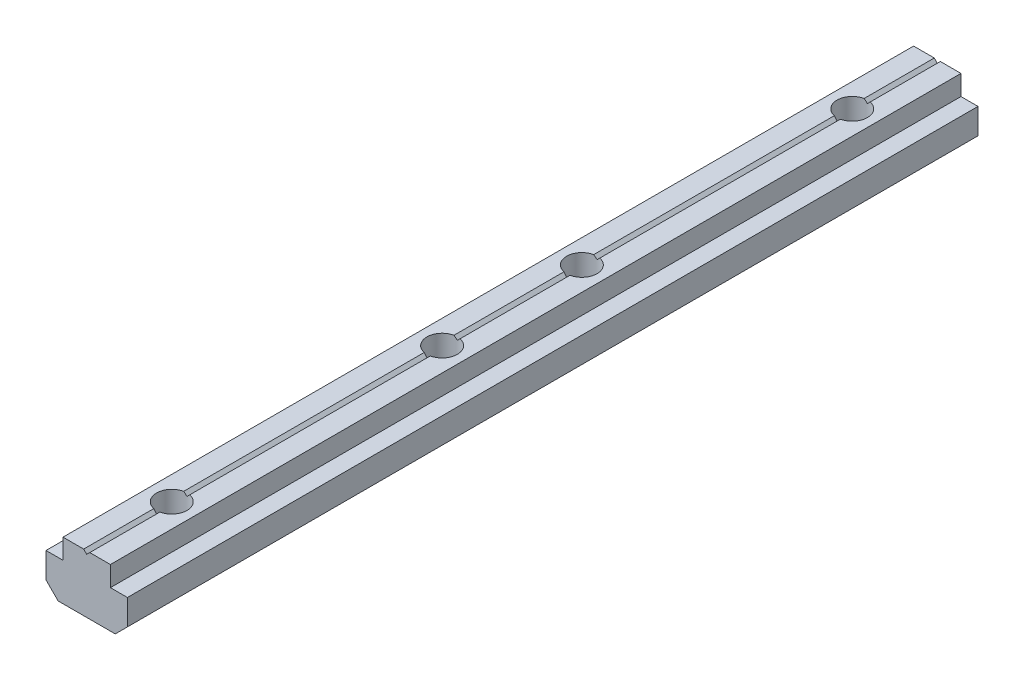
ISO-10303-21;
HEADER;
FILE_DESCRIPTION(('STEP AP214'),'2;1');
FILE_NAME('part.step','',(''),(''),'','','');
FILE_SCHEMA(('AUTOMOTIVE_DESIGN { 1 0 10303 214 1 1 1 1 }'));
ENDSEC;
DATA;
#1=APPLICATION_CONTEXT('core data for automotive mechanical design processes');
#2=APPLICATION_PROTOCOL_DEFINITION('international standard','automotive_design',2000,#1);
#3=PRODUCT_CONTEXT('',#1,'mechanical');
#4=PRODUCT('Part','Part','',(#3));
#5=PRODUCT_RELATED_PRODUCT_CATEGORY('part','',(#4));
#6=PRODUCT_DEFINITION_FORMATION('','',#4);
#7=PRODUCT_DEFINITION_CONTEXT('part definition',#1,'design');
#8=PRODUCT_DEFINITION('design','',#6,#7);
#9=PRODUCT_DEFINITION_SHAPE('','',#8);
#10=(LENGTH_UNIT() NAMED_UNIT(*) SI_UNIT(.MILLI.,.METRE.));
#11=(NAMED_UNIT(*) PLANE_ANGLE_UNIT() SI_UNIT($,.RADIAN.));
#12=(NAMED_UNIT(*) SI_UNIT($,.STERADIAN.) SOLID_ANGLE_UNIT());
#13=UNCERTAINTY_MEASURE_WITH_UNIT(LENGTH_MEASURE(1.E-05),#10,'distance_accuracy_value','');
#14=(GEOMETRIC_REPRESENTATION_CONTEXT(3) GLOBAL_UNCERTAINTY_ASSIGNED_CONTEXT((#13)) GLOBAL_UNIT_ASSIGNED_CONTEXT((#10,
#11,#12)) REPRESENTATION_CONTEXT('',''));
#15=CARTESIAN_POINT('',(0.,0.,0.));
#16=DIRECTION('',(0.,0.,1.));
#17=DIRECTION('',(1.,0.,0.));
#18=AXIS2_PLACEMENT_3D('',#15,#16,#17);
#19=CARTESIAN_POINT('',(-6.70000000000005,2.79999999999995,140.));
#20=DIRECTION('',(0.707106781186468,-0.707106781186628,0.));
#21=DIRECTION('',(0.707106781186628,0.707106781186468,0.));
#22=AXIS2_PLACEMENT_3D('',#19,#20,#21);
#23=PLANE('',#22);
#24=DIRECTION('',(0.,0.,-1.));
#25=VECTOR('',#24,1.);
#26=CARTESIAN_POINT('',(-6.70000000000005,2.79999999999995,140.));
#27=LINE('',#26,#25);
#28=CARTESIAN_POINT('',(-6.70000000000005,2.79999999999995,11.5));
#29=VERTEX_POINT('',#28);
#30=CARTESIAN_POINT('',(-6.70000000000005,2.79999999999995,0.));
#31=VERTEX_POINT('',#30);
#32=EDGE_CURVE('E233',#29,#31,#27,.T.);
#33=ORIENTED_EDGE('',*,*,#32,.F.);
#34=CARTESIAN_POINT('',(-6.70000000000022,2.79999999999978,14.));
#35=DIRECTION('',(0.707106781186468,-0.707106781186628,0.));
#36=DIRECTION('',(-0.707106781186628,-0.707106781186468,0.));
#37=AXIS2_PLACEMENT_3D('',#34,#35,#36);
#38=ELLIPSE('',#37,3.53553390593232,2.49999999999999);
#39=CARTESIAN_POINT('',(-6.19999999999993,3.29999999999995,11.5505102572169));
#40=VERTEX_POINT('',#39);
#41=EDGE_CURVE('E405',#29,#40,#38,.T.);
#42=ORIENTED_EDGE('',*,*,#41,.T.);
#43=DIRECTION('',(0.,0.,-1.));
#44=VECTOR('',#43,1.);
#45=CARTESIAN_POINT('',(-6.19999999999993,3.29999999999995,140.));
#46=LINE('',#45,#44);
#47=CARTESIAN_POINT('',(-6.19999999999993,3.29999999999995,0.));
#48=VERTEX_POINT('',#47);
#49=EDGE_CURVE('E238',#40,#48,#46,.T.);
#50=ORIENTED_EDGE('',*,*,#49,.T.);
#51=DIRECTION('',(-0.707106781186628,-0.707106781186468,0.));
#52=VECTOR('',#51,1.);
#53=CARTESIAN_POINT('',(-6.70000000000005,2.79999999999995,0.));
#54=LINE('',#53,#52);
#55=EDGE_CURVE('E287',#48,#31,#54,.T.);
#56=ORIENTED_EDGE('',*,*,#55,.T.);
#57=EDGE_LOOP('',(#33,#42,#50,#56));
#58=FACE_BOUND('',#57,.T.);
#59=ADVANCED_FACE('F37',(#58),#23,.F.);
#60=CARTESIAN_POINT('',(-6.70000000000005,2.79999999999995,140.));
#61=DIRECTION('',(-0.707106781186547,-0.707106781186548,0.));
#62=DIRECTION('',(0.707106781186548,-0.707106781186547,0.));
#63=AXIS2_PLACEMENT_3D('',#60,#61,#62);
#64=PLANE('',#63);
#65=CARTESIAN_POINT('',(-6.70000000000005,2.79999999999995,56.));
#66=VERTEX_POINT('',#65);
#67=CARTESIAN_POINT('',(-6.70000000000005,2.79999999999995,16.5));
#68=VERTEX_POINT('',#67);
#69=EDGE_CURVE('E217',#66,#68,#27,.T.);
#70=ORIENTED_EDGE('',*,*,#69,.T.);
#71=CARTESIAN_POINT('',(-6.70000000000022,2.80000000000013,14.));
#72=DIRECTION('',(-0.707106781186547,-0.707106781186548,0.));
#73=DIRECTION('',(0.707106781186548,-0.707106781186547,0.));
#74=AXIS2_PLACEMENT_3D('',#71,#72,#73);
#75=ELLIPSE('',#74,3.53553390593272,2.49999999999999);
#76=CARTESIAN_POINT('',(-7.20000000000005,3.29999999999995,16.4494897427832));
#77=VERTEX_POINT('',#76);
#78=EDGE_CURVE('E204',#68,#77,#75,.T.);
#79=ORIENTED_EDGE('',*,*,#78,.T.);
#80=DIRECTION('',(0.,0.,-1.));
#81=VECTOR('',#80,1.);
#82=CARTESIAN_POINT('',(-7.20000000000005,3.29999999999995,140.));
#83=LINE('',#82,#81);
#84=CARTESIAN_POINT('',(-7.20000000000005,3.29999999999995,56.0505102572168));
#85=VERTEX_POINT('',#84);
#86=EDGE_CURVE('E215',#85,#77,#83,.T.);
#87=ORIENTED_EDGE('',*,*,#86,.F.);
#88=CARTESIAN_POINT('',(-6.70000000000022,2.80000000000013,58.5));
#89=DIRECTION('',(-0.707106781186547,-0.707106781186548,0.));
#90=DIRECTION('',(0.707106781186548,-0.707106781186547,0.));
#91=AXIS2_PLACEMENT_3D('',#88,#89,#90);
#92=ELLIPSE('',#91,3.53553390593272,2.49999999999999);
#93=EDGE_CURVE('E397',#85,#66,#92,.T.);
#94=ORIENTED_EDGE('',*,*,#93,.T.);
#95=EDGE_LOOP('',(#70,#79,#87,#94));
#96=FACE_BOUND('',#95,.T.);
#97=ADVANCED_FACE('F214',(#96),#64,.F.);
#98=CARTESIAN_POINT('',(-6.19999999999993,3.29999999999995,56.0505102572169));
#99=VERTEX_POINT('',#98);
#100=CARTESIAN_POINT('',(-6.19999999999993,3.29999999999995,16.4494897427831));
#101=VERTEX_POINT('',#100);
#102=EDGE_CURVE('E467',#99,#101,#46,.T.);
#103=ORIENTED_EDGE('',*,*,#102,.T.);
#104=EDGE_CURVE('E218',#101,#68,#38,.T.);
#105=ORIENTED_EDGE('',*,*,#104,.T.);
#106=ORIENTED_EDGE('',*,*,#69,.F.);
#107=CARTESIAN_POINT('',(-6.70000000000022,2.79999999999978,58.5));
#108=DIRECTION('',(0.707106781186468,-0.707106781186628,0.));
#109=DIRECTION('',(-0.707106781186628,-0.707106781186468,0.));
#110=AXIS2_PLACEMENT_3D('',#107,#108,#109);
#111=ELLIPSE('',#110,3.53553390593232,2.49999999999999);
#112=EDGE_CURVE('E60',#66,#99,#111,.T.);
#113=ORIENTED_EDGE('',*,*,#112,.T.);
#114=EDGE_LOOP('',(#103,#105,#106,#113));
#115=FACE_BOUND('',#114,.T.);
#116=ADVANCED_FACE('F491',(#115),#23,.F.);
#117=CARTESIAN_POINT('',(-6.70000000000005,2.79999999999995,79.));
#118=VERTEX_POINT('',#117);
#119=CARTESIAN_POINT('',(-6.70000000000005,2.79999999999995,61.));
#120=VERTEX_POINT('',#119);
#121=EDGE_CURVE('E482',#118,#120,#27,.T.);
#122=ORIENTED_EDGE('',*,*,#121,.T.);
#123=CARTESIAN_POINT('',(-7.20000000000005,3.29999999999995,60.9494897427832));
#124=VERTEX_POINT('',#123);
#125=EDGE_CURVE('E394',#120,#124,#92,.T.);
#126=ORIENTED_EDGE('',*,*,#125,.T.);
#127=CARTESIAN_POINT('',(-7.20000000000005,3.29999999999995,79.0505102572168));
#128=VERTEX_POINT('',#127);
#129=EDGE_CURVE('E224',#128,#124,#83,.T.);
#130=ORIENTED_EDGE('',*,*,#129,.F.);
#131=CARTESIAN_POINT('',(-6.70000000000022,2.80000000000013,81.5));
#132=DIRECTION('',(-0.707106781186547,-0.707106781186548,0.));
#133=DIRECTION('',(0.707106781186548,-0.707106781186547,0.));
#134=AXIS2_PLACEMENT_3D('',#131,#132,#133);
#135=ELLIPSE('',#134,3.53553390593272,2.49999999999999);
#136=EDGE_CURVE('E377',#128,#118,#135,.T.);
#137=ORIENTED_EDGE('',*,*,#136,.T.);
#138=EDGE_LOOP('',(#122,#126,#130,#137));
#139=FACE_BOUND('',#138,.T.);
#140=ADVANCED_FACE('F487',(#139),#64,.F.);
#141=CARTESIAN_POINT('',(-6.19999999999993,3.29999999999995,79.0505102572169));
#142=VERTEX_POINT('',#141);
#143=CARTESIAN_POINT('',(-6.19999999999993,3.29999999999995,60.9494897427831));
#144=VERTEX_POINT('',#143);
#145=EDGE_CURVE('E465',#142,#144,#46,.T.);
#146=ORIENTED_EDGE('',*,*,#145,.T.);
#147=EDGE_CURVE('E390',#144,#120,#111,.T.);
#148=ORIENTED_EDGE('',*,*,#147,.T.);
#149=ORIENTED_EDGE('',*,*,#121,.F.);
#150=CARTESIAN_POINT('',(-6.70000000000022,2.79999999999978,81.5));
#151=DIRECTION('',(0.707106781186468,-0.707106781186628,0.));
#152=DIRECTION('',(-0.707106781186628,-0.707106781186468,0.));
#153=AXIS2_PLACEMENT_3D('',#150,#151,#152);
#154=ELLIPSE('',#153,3.53553390593232,2.49999999999999);
#155=EDGE_CURVE('E380',#118,#142,#154,.T.);
#156=ORIENTED_EDGE('',*,*,#155,.T.);
#157=EDGE_LOOP('',(#146,#148,#149,#156));
#158=FACE_BOUND('',#157,.T.);
#159=ADVANCED_FACE('F489',(#158),#23,.F.);
#160=CARTESIAN_POINT('',(-6.70000000000005,2.79999999999995,123.5));
#161=VERTEX_POINT('',#160);
#162=CARTESIAN_POINT('',(-6.70000000000005,2.79999999999995,84.));
#163=VERTEX_POINT('',#162);
#164=EDGE_CURVE('E239',#161,#163,#27,.T.);
#165=ORIENTED_EDGE('',*,*,#164,.T.);
#166=CARTESIAN_POINT('',(-7.20000000000005,3.29999999999995,83.9494897427832));
#167=VERTEX_POINT('',#166);
#168=EDGE_CURVE('E376',#163,#167,#135,.T.);
#169=ORIENTED_EDGE('',*,*,#168,.T.);
#170=CARTESIAN_POINT('',(-7.20000000000005,3.29999999999995,123.550510257217));
#171=VERTEX_POINT('',#170);
#172=EDGE_CURVE('E227',#171,#167,#83,.T.);
#173=ORIENTED_EDGE('',*,*,#172,.F.);
#174=CARTESIAN_POINT('',(-6.70000000000022,2.80000000000013,126.));
#175=DIRECTION('',(-0.707106781186547,-0.707106781186548,0.));
#176=DIRECTION('',(0.707106781186548,-0.707106781186547,0.));
#177=AXIS2_PLACEMENT_3D('',#174,#175,#176);
#178=ELLIPSE('',#177,3.53553390593272,2.49999999999999);
#179=EDGE_CURVE('E367',#171,#161,#178,.T.);
#180=ORIENTED_EDGE('',*,*,#179,.T.);
#181=EDGE_LOOP('',(#165,#169,#173,#180));
#182=FACE_BOUND('',#181,.T.);
#183=ADVANCED_FACE('F457',(#182),#64,.F.);
#184=CARTESIAN_POINT('',(-6.70000000000005,2.79999999999995,140.));
#185=VERTEX_POINT('',#184);
#186=CARTESIAN_POINT('',(-6.70000000000005,2.79999999999995,128.5));
#187=VERTEX_POINT('',#186);
#188=EDGE_CURVE('E235',#185,#187,#27,.T.);
#189=ORIENTED_EDGE('',*,*,#188,.T.);
#190=CARTESIAN_POINT('',(-7.20000000000005,3.29999999999995,128.449489742783));
#191=VERTEX_POINT('',#190);
#192=EDGE_CURVE('E366',#187,#191,#178,.T.);
#193=ORIENTED_EDGE('',*,*,#192,.T.);
#194=CARTESIAN_POINT('',(-7.20000000000005,3.29999999999995,140.));
#195=VERTEX_POINT('',#194);
#196=EDGE_CURVE('E229',#195,#191,#83,.T.);
#197=ORIENTED_EDGE('',*,*,#196,.F.);
#198=DIRECTION('',(-0.707106781186548,0.707106781186547,0.));
#199=VECTOR('',#198,1.);
#200=CARTESIAN_POINT('',(-6.70000000000005,2.79999999999995,140.));
#201=LINE('',#200,#199);
#202=EDGE_CURVE('E351',#185,#195,#201,.T.);
#203=ORIENTED_EDGE('',*,*,#202,.F.);
#204=EDGE_LOOP('',(#189,#193,#197,#203));
#205=FACE_BOUND('',#204,.T.);
#206=ADVANCED_FACE('F450',(#205),#64,.F.);
#207=CARTESIAN_POINT('',(-6.19999999999993,3.29999999999995,123.550510257217));
#208=VERTEX_POINT('',#207);
#209=CARTESIAN_POINT('',(-6.19999999999993,3.29999999999995,83.9494897427831));
#210=VERTEX_POINT('',#209);
#211=EDGE_CURVE('E244',#208,#210,#46,.T.);
#212=ORIENTED_EDGE('',*,*,#211,.T.);
#213=EDGE_CURVE('E381',#210,#163,#154,.T.);
#214=ORIENTED_EDGE('',*,*,#213,.T.);
#215=ORIENTED_EDGE('',*,*,#164,.F.);
#216=CARTESIAN_POINT('',(-6.70000000000022,2.79999999999978,126.));
#217=DIRECTION('',(0.707106781186468,-0.707106781186628,0.));
#218=DIRECTION('',(-0.707106781186628,-0.707106781186468,0.));
#219=AXIS2_PLACEMENT_3D('',#216,#217,#218);
#220=ELLIPSE('',#219,3.53553390593232,2.49999999999999);
#221=EDGE_CURVE('E275',#161,#208,#220,.T.);
#222=ORIENTED_EDGE('',*,*,#221,.T.);
#223=EDGE_LOOP('',(#212,#214,#215,#222));
#224=FACE_BOUND('',#223,.T.);
#225=ADVANCED_FACE('F463',(#224),#23,.F.);
#226=CARTESIAN_POINT('',(-2.00000000000023,-6.20000000000027,140.));
#227=DIRECTION('',(-0.707106781186548,0.707106781186548,0.));
#228=DIRECTION('',(-0.707106781186548,-0.707106781186548,0.));
#229=AXIS2_PLACEMENT_3D('',#226,#227,#228);
#230=PLANE('',#229);
#231=DIRECTION('',(0.707106781186547,0.707106781186547,0.));
#232=VECTOR('',#231,1.);
#233=CARTESIAN_POINT('',(-2.00000000000023,-6.20000000000027,0.));
#234=LINE('',#233,#232);
#235=CARTESIAN_POINT('',(-2.00000000000023,-6.20000000000027,0.));
#236=VERTEX_POINT('',#235);
#237=CARTESIAN_POINT('',(0.,-4.20000000000005,0.));
#238=VERTEX_POINT('',#237);
#239=EDGE_CURVE('E265',#236,#238,#234,.T.);
#240=ORIENTED_EDGE('',*,*,#239,.T.);
#241=DIRECTION('',(0.,0.,-1.));
#242=VECTOR('',#241,1.);
#243=CARTESIAN_POINT('',(0.,-4.20000000000005,140.));
#244=LINE('',#243,#242);
#245=CARTESIAN_POINT('',(0.,-4.20000000000005,140.));
#246=VERTEX_POINT('',#245);
#247=EDGE_CURVE('E45',#246,#238,#244,.T.);
#248=ORIENTED_EDGE('',*,*,#247,.F.);
#249=DIRECTION('',(0.707106781186547,0.707106781186547,0.));
#250=VECTOR('',#249,1.);
#251=CARTESIAN_POINT('',(-2.00000000000023,-6.20000000000027,140.));
#252=LINE('',#251,#250);
#253=CARTESIAN_POINT('',(-2.00000000000023,-6.20000000000027,140.));
#254=VERTEX_POINT('',#253);
#255=EDGE_CURVE('E305',#254,#246,#252,.T.);
#256=ORIENTED_EDGE('',*,*,#255,.F.);
#257=DIRECTION('',(0.,0.,-1.));
#258=VECTOR('',#257,1.);
#259=CARTESIAN_POINT('',(-2.00000000000023,-6.20000000000027,140.));
#260=LINE('',#259,#258);
#261=EDGE_CURVE('E267',#254,#236,#260,.T.);
#262=ORIENTED_EDGE('',*,*,#261,.T.);
#263=EDGE_LOOP('',(#240,#248,#256,#262));
#264=FACE_BOUND('',#263,.T.);
#265=ADVANCED_FACE('F39',(#264),#230,.F.);
#266=CARTESIAN_POINT('',(0.,0.,140.));
#267=DIRECTION('',(-1.,0.,0.));
#268=DIRECTION('',(0.,-1.,0.));
#269=AXIS2_PLACEMENT_3D('',#266,#267,#268);
#270=PLANE('',#269);
#271=DIRECTION('',(0.,1.,0.));
#272=VECTOR('',#271,1.);
#273=CARTESIAN_POINT('',(0.,0.,0.));
#274=LINE('',#273,#272);
#275=CARTESIAN_POINT('',(0.,0.,0.));
#276=VERTEX_POINT('',#275);
#277=EDGE_CURVE('E258',#238,#276,#274,.T.);
#278=ORIENTED_EDGE('',*,*,#277,.T.);
#279=DIRECTION('',(0.,0.,-1.));
#280=VECTOR('',#279,1.);
#281=CARTESIAN_POINT('',(0.,0.,140.));
#282=LINE('',#281,#280);
#283=CARTESIAN_POINT('',(0.,0.,140.));
#284=VERTEX_POINT('',#283);
#285=EDGE_CURVE('E250',#284,#276,#282,.T.);
#286=ORIENTED_EDGE('',*,*,#285,.F.);
#287=DIRECTION('',(0.,1.,0.));
#288=VECTOR('',#287,1.);
#289=CARTESIAN_POINT('',(0.,0.,140.));
#290=LINE('',#289,#288);
#291=EDGE_CURVE('E259',#246,#284,#290,.T.);
#292=ORIENTED_EDGE('',*,*,#291,.F.);
#293=ORIENTED_EDGE('',*,*,#247,.T.);
#294=EDGE_LOOP('',(#278,#286,#292,#293));
#295=FACE_BOUND('',#294,.T.);
#296=ADVANCED_FACE('F256',(#295),#270,.F.);
#297=CARTESIAN_POINT('',(-2.80000000000007,0.,140.));
#298=DIRECTION('',(0.,-1.,0.));
#299=DIRECTION('',(1.,0.,0.));
#300=AXIS2_PLACEMENT_3D('',#297,#298,#299);
#301=PLANE('',#300);
#302=DIRECTION('',(-1.,0.,0.));
#303=VECTOR('',#302,1.);
#304=CARTESIAN_POINT('',(-2.80000000000007,0.,0.));
#305=LINE('',#304,#303);
#306=CARTESIAN_POINT('',(-2.80000000000007,0.,0.));
#307=VERTEX_POINT('',#306);
#308=EDGE_CURVE('E272',#276,#307,#305,.T.);
#309=ORIENTED_EDGE('',*,*,#308,.T.);
#310=DIRECTION('',(0.,0.,-1.));
#311=VECTOR('',#310,1.);
#312=CARTESIAN_POINT('',(-2.80000000000007,0.,140.));
#313=LINE('',#312,#311);
#314=CARTESIAN_POINT('',(-2.80000000000007,0.,140.));
#315=VERTEX_POINT('',#314);
#316=EDGE_CURVE('E247',#315,#307,#313,.T.);
#317=ORIENTED_EDGE('',*,*,#316,.F.);
#318=DIRECTION('',(-1.,0.,0.));
#319=VECTOR('',#318,1.);
#320=CARTESIAN_POINT('',(-2.80000000000007,0.,140.));
#321=LINE('',#320,#319);
#322=EDGE_CURVE('E359',#284,#315,#321,.T.);
#323=ORIENTED_EDGE('',*,*,#322,.F.);
#324=ORIENTED_EDGE('',*,*,#285,.T.);
#325=EDGE_LOOP('',(#309,#317,#323,#324));
#326=FACE_BOUND('',#325,.T.);
#327=ADVANCED_FACE('F430',(#326),#301,.F.);
#328=CARTESIAN_POINT('',(-2.80000000000007,3.29999999999995,140.));
#329=DIRECTION('',(-1.,0.,0.));
#330=DIRECTION('',(0.,0.,1.));
#331=AXIS2_PLACEMENT_3D('',#328,#329,#330);
#332=PLANE('',#331);
#333=DIRECTION('',(0.,1.,0.));
#334=VECTOR('',#333,1.);
#335=CARTESIAN_POINT('',(-2.80000000000007,3.29999999999995,0.));
#336=LINE('',#335,#334);
#337=CARTESIAN_POINT('',(-2.80000000000007,3.29999999999995,0.));
#338=VERTEX_POINT('',#337);
#339=EDGE_CURVE('E282',#307,#338,#336,.T.);
#340=ORIENTED_EDGE('',*,*,#339,.T.);
#341=DIRECTION('',(0.,0.,-1.));
#342=VECTOR('',#341,1.);
#343=CARTESIAN_POINT('',(-2.80000000000007,3.29999999999995,140.));
#344=LINE('',#343,#342);
#345=CARTESIAN_POINT('',(-2.80000000000007,3.29999999999995,140.));
#346=VERTEX_POINT('',#345);
#347=EDGE_CURVE('E243',#346,#338,#344,.T.);
#348=ORIENTED_EDGE('',*,*,#347,.F.);
#349=DIRECTION('',(0.,1.,0.));
#350=VECTOR('',#349,1.);
#351=CARTESIAN_POINT('',(-2.80000000000007,3.29999999999995,140.));
#352=LINE('',#351,#350);
#353=EDGE_CURVE('E357',#315,#346,#352,.T.);
#354=ORIENTED_EDGE('',*,*,#353,.F.);
#355=ORIENTED_EDGE('',*,*,#316,.T.);
#356=EDGE_LOOP('',(#340,#348,#354,#355));
#357=FACE_BOUND('',#356,.T.);
#358=ADVANCED_FACE('F435',(#357),#332,.F.);
#359=CARTESIAN_POINT('',(-6.19999999999993,3.29999999999995,140.));
#360=DIRECTION('',(0.,-1.,0.));
#361=DIRECTION('',(1.,0.,0.));
#362=AXIS2_PLACEMENT_3D('',#359,#360,#361);
#363=PLANE('',#362);
#364=ORIENTED_EDGE('',*,*,#49,.F.);
#365=CARTESIAN_POINT('',(-6.70000000000022,3.29999999999995,14.));
#366=DIRECTION('',(0.,-1.,0.));
#367=DIRECTION('',(1.,0.,0.));
#368=AXIS2_PLACEMENT_3D('',#365,#366,#367);
#369=CIRCLE('',#368,2.49999999999999);
#370=EDGE_CURVE('E402',#40,#101,#369,.T.);
#371=ORIENTED_EDGE('',*,*,#370,.T.);
#372=ORIENTED_EDGE('',*,*,#102,.F.);
#373=CARTESIAN_POINT('',(-6.70000000000022,3.29999999999995,58.5));
#374=DIRECTION('',(0.,-1.,0.));
#375=DIRECTION('',(1.,0.,0.));
#376=AXIS2_PLACEMENT_3D('',#373,#374,#375);
#377=CIRCLE('',#376,2.49999999999999);
#378=EDGE_CURVE('E391',#99,#144,#377,.T.);
#379=ORIENTED_EDGE('',*,*,#378,.T.);
#380=ORIENTED_EDGE('',*,*,#145,.F.);
#381=CARTESIAN_POINT('',(-6.70000000000022,3.29999999999995,81.5));
#382=DIRECTION('',(0.,-1.,0.));
#383=DIRECTION('',(1.,0.,0.));
#384=AXIS2_PLACEMENT_3D('',#381,#382,#383);
#385=CIRCLE('',#384,2.49999999999999);
#386=EDGE_CURVE('E384',#142,#210,#385,.T.);
#387=ORIENTED_EDGE('',*,*,#386,.T.);
#388=ORIENTED_EDGE('',*,*,#211,.F.);
#389=CARTESIAN_POINT('',(-6.70000000000022,3.29999999999995,126.));
#390=DIRECTION('',(0.,-1.,0.));
#391=DIRECTION('',(1.,0.,0.));
#392=AXIS2_PLACEMENT_3D('',#389,#390,#391);
#393=CIRCLE('',#392,2.49999999999999);
#394=CARTESIAN_POINT('',(-6.19999999999993,3.29999999999995,128.449489742783));
#395=VERTEX_POINT('',#394);
#396=EDGE_CURVE('E270',#208,#395,#393,.T.);
#397=ORIENTED_EDGE('',*,*,#396,.T.);
#398=CARTESIAN_POINT('',(-6.19999999999993,3.29999999999995,140.));
#399=VERTEX_POINT('',#398);
#400=EDGE_CURVE('E240',#399,#395,#46,.T.);
#401=ORIENTED_EDGE('',*,*,#400,.F.);
#402=DIRECTION('',(-1.,0.,0.));
#403=VECTOR('',#402,1.);
#404=CARTESIAN_POINT('',(-6.19999999999993,3.29999999999995,140.));
#405=LINE('',#404,#403);
#406=EDGE_CURVE('E355',#346,#399,#405,.T.);
#407=ORIENTED_EDGE('',*,*,#406,.F.);
#408=ORIENTED_EDGE('',*,*,#347,.T.);
#409=DIRECTION('',(-1.,0.,0.));
#410=VECTOR('',#409,1.);
#411=CARTESIAN_POINT('',(-6.19999999999993,3.29999999999995,0.));
#412=LINE('',#411,#410);
#413=EDGE_CURVE('E284',#338,#48,#412,.T.);
#414=ORIENTED_EDGE('',*,*,#413,.T.);
#415=EDGE_LOOP('',(#364,#371,#372,#379,#380,#387,#388,#397,#401,#407,#408,#414));
#416=FACE_BOUND('',#415,.T.);
#417=ADVANCED_FACE('F442',(#416),#363,.F.);
#418=ORIENTED_EDGE('',*,*,#400,.T.);
#419=EDGE_CURVE('E363',#395,#187,#220,.T.);
#420=ORIENTED_EDGE('',*,*,#419,.T.);
#421=ORIENTED_EDGE('',*,*,#188,.F.);
#422=DIRECTION('',(-0.707106781186628,-0.707106781186468,0.));
#423=VECTOR('',#422,1.);
#424=CARTESIAN_POINT('',(-6.70000000000005,2.79999999999995,140.));
#425=LINE('',#424,#423);
#426=EDGE_CURVE('E353',#399,#185,#425,.T.);
#427=ORIENTED_EDGE('',*,*,#426,.F.);
#428=EDGE_LOOP('',(#418,#420,#421,#427));
#429=FACE_BOUND('',#428,.T.);
#430=ADVANCED_FACE('F445',(#429),#23,.F.);
#431=CARTESIAN_POINT('',(-7.20000000000005,3.29999999999995,11.5505102572168));
#432=VERTEX_POINT('',#431);
#433=CARTESIAN_POINT('',(-7.20000000000005,3.29999999999995,0.));
#434=VERTEX_POINT('',#433);
#435=EDGE_CURVE('E225',#432,#434,#83,.T.);
#436=ORIENTED_EDGE('',*,*,#435,.F.);
#437=EDGE_CURVE('E52',#432,#29,#75,.T.);
#438=ORIENTED_EDGE('',*,*,#437,.T.);
#439=ORIENTED_EDGE('',*,*,#32,.T.);
#440=DIRECTION('',(-0.707106781186548,0.707106781186547,0.));
#441=VECTOR('',#440,1.);
#442=CARTESIAN_POINT('',(-6.70000000000005,2.79999999999995,0.));
#443=LINE('',#442,#441);
#444=EDGE_CURVE('E290',#31,#434,#443,.T.);
#445=ORIENTED_EDGE('',*,*,#444,.T.);
#446=EDGE_LOOP('',(#436,#438,#439,#445));
#447=FACE_BOUND('',#446,.T.);
#448=ADVANCED_FACE('F481',(#447),#64,.F.);
#449=CARTESIAN_POINT('',(-10.6,3.29999999999995,140.));
#450=DIRECTION('',(0.,-1.,0.));
#451=DIRECTION('',(0.,0.,-1.));
#452=AXIS2_PLACEMENT_3D('',#449,#450,#451);
#453=PLANE('',#452);
#454=ORIENTED_EDGE('',*,*,#86,.T.);
#455=CARTESIAN_POINT('',(-6.70000000000022,3.29999999999995,14.));
#456=DIRECTION('',(0.,-1.,0.));
#457=DIRECTION('',(0.,0.,-1.));
#458=AXIS2_PLACEMENT_3D('',#455,#456,#457);
#459=CIRCLE('',#458,2.49999999999999);
#460=EDGE_CURVE('E201',#77,#432,#459,.T.);
#461=ORIENTED_EDGE('',*,*,#460,.T.);
#462=ORIENTED_EDGE('',*,*,#435,.T.);
#463=DIRECTION('',(-1.,0.,0.));
#464=VECTOR('',#463,1.);
#465=CARTESIAN_POINT('',(-10.6,3.29999999999995,0.));
#466=LINE('',#465,#464);
#467=CARTESIAN_POINT('',(-10.6,3.29999999999995,0.));
#468=VERTEX_POINT('',#467);
#469=EDGE_CURVE('E293',#434,#468,#466,.T.);
#470=ORIENTED_EDGE('',*,*,#469,.T.);
#471=DIRECTION('',(0.,0.,-1.));
#472=VECTOR('',#471,1.);
#473=CARTESIAN_POINT('',(-10.6,3.29999999999995,140.));
#474=LINE('',#473,#472);
#475=CARTESIAN_POINT('',(-10.6,3.29999999999995,140.));
#476=VERTEX_POINT('',#475);
#477=EDGE_CURVE('E228',#476,#468,#474,.T.);
#478=ORIENTED_EDGE('',*,*,#477,.F.);
#479=DIRECTION('',(-1.,0.,0.));
#480=VECTOR('',#479,1.);
#481=CARTESIAN_POINT('',(-10.6,3.29999999999995,140.));
#482=LINE('',#481,#480);
#483=EDGE_CURVE('E349',#195,#476,#482,.T.);
#484=ORIENTED_EDGE('',*,*,#483,.F.);
#485=ORIENTED_EDGE('',*,*,#196,.T.);
#486=CARTESIAN_POINT('',(-6.70000000000022,3.29999999999995,126.));
#487=DIRECTION('',(0.,-1.,0.));
#488=DIRECTION('',(0.,0.,-1.));
#489=AXIS2_PLACEMENT_3D('',#486,#487,#488);
#490=CIRCLE('',#489,2.49999999999999);
#491=EDGE_CURVE('E11',#191,#171,#490,.T.);
#492=ORIENTED_EDGE('',*,*,#491,.T.);
#493=ORIENTED_EDGE('',*,*,#172,.T.);
#494=CARTESIAN_POINT('',(-6.70000000000022,3.29999999999995,81.5));
#495=DIRECTION('',(0.,-1.,0.));
#496=DIRECTION('',(0.,0.,-1.));
#497=AXIS2_PLACEMENT_3D('',#494,#495,#496);
#498=CIRCLE('',#497,2.49999999999999);
#499=EDGE_CURVE('E373',#167,#128,#498,.T.);
#500=ORIENTED_EDGE('',*,*,#499,.T.);
#501=ORIENTED_EDGE('',*,*,#129,.T.);
#502=CARTESIAN_POINT('',(-6.70000000000022,3.29999999999995,58.5));
#503=DIRECTION('',(0.,-1.,0.));
#504=DIRECTION('',(0.,0.,-1.));
#505=AXIS2_PLACEMENT_3D('',#502,#503,#504);
#506=CIRCLE('',#505,2.49999999999999);
#507=EDGE_CURVE('E223',#124,#85,#506,.T.);
#508=ORIENTED_EDGE('',*,*,#507,.T.);
#509=EDGE_LOOP('',(#454,#461,#462,#470,#478,#484,#485,#492,#493,#500,#501,#508));
#510=FACE_BOUND('',#509,.T.);
#511=ADVANCED_FACE('F221',(#510),#453,.F.);
#512=CARTESIAN_POINT('',(-10.6,3.29999999999995,140.));
#513=DIRECTION('',(1.,0.,0.));
#514=DIRECTION('',(0.,0.,-1.));
#515=AXIS2_PLACEMENT_3D('',#512,#513,#514);
#516=PLANE('',#515);
#517=DIRECTION('',(0.,-1.,0.));
#518=VECTOR('',#517,1.);
#519=CARTESIAN_POINT('',(-10.6,3.29999999999995,0.));
#520=LINE('',#519,#518);
#521=CARTESIAN_POINT('',(-10.6,0.,0.));
#522=VERTEX_POINT('',#521);
#523=EDGE_CURVE('E295',#468,#522,#520,.T.);
#524=ORIENTED_EDGE('',*,*,#523,.T.);
#525=DIRECTION('',(0.,0.,-1.));
#526=VECTOR('',#525,1.);
#527=CARTESIAN_POINT('',(-10.6,0.,140.));
#528=LINE('',#527,#526);
#529=CARTESIAN_POINT('',(-10.6,0.,140.));
#530=VERTEX_POINT('',#529);
#531=EDGE_CURVE('E315',#530,#522,#528,.T.);
#532=ORIENTED_EDGE('',*,*,#531,.F.);
#533=DIRECTION('',(0.,-1.,0.));
#534=VECTOR('',#533,1.);
#535=CARTESIAN_POINT('',(-10.6,3.29999999999995,140.));
#536=LINE('',#535,#534);
#537=EDGE_CURVE('E327',#476,#530,#536,.T.);
#538=ORIENTED_EDGE('',*,*,#537,.F.);
#539=ORIENTED_EDGE('',*,*,#477,.T.);
#540=EDGE_LOOP('',(#524,#532,#538,#539));
#541=FACE_BOUND('',#540,.T.);
#542=ADVANCED_FACE('F326',(#541),#516,.F.);
#543=CARTESIAN_POINT('',(-13.4000000000001,0.,140.));
#544=DIRECTION('',(0.,-1.,0.));
#545=DIRECTION('',(1.,0.,0.));
#546=AXIS2_PLACEMENT_3D('',#543,#544,#545);
#547=PLANE('',#546);
#548=DIRECTION('',(-1.,0.,0.));
#549=VECTOR('',#548,1.);
#550=CARTESIAN_POINT('',(-13.4000000000001,0.,0.));
#551=LINE('',#550,#549);
#552=CARTESIAN_POINT('',(-13.4000000000001,0.,0.));
#553=VERTEX_POINT('',#552);
#554=EDGE_CURVE('E297',#522,#553,#551,.T.);
#555=ORIENTED_EDGE('',*,*,#554,.T.);
#556=DIRECTION('',(0.,0.,-1.));
#557=VECTOR('',#556,1.);
#558=CARTESIAN_POINT('',(-13.4000000000001,0.,140.));
#559=LINE('',#558,#557);
#560=CARTESIAN_POINT('',(-13.4000000000001,0.,140.));
#561=VERTEX_POINT('',#560);
#562=EDGE_CURVE('E313',#561,#553,#559,.T.);
#563=ORIENTED_EDGE('',*,*,#562,.F.);
#564=DIRECTION('',(-1.,0.,0.));
#565=VECTOR('',#564,1.);
#566=CARTESIAN_POINT('',(-13.4000000000001,0.,140.));
#567=LINE('',#566,#565);
#568=EDGE_CURVE('E344',#530,#561,#567,.T.);
#569=ORIENTED_EDGE('',*,*,#568,.F.);
#570=ORIENTED_EDGE('',*,*,#531,.T.);
#571=EDGE_LOOP('',(#555,#563,#569,#570));
#572=FACE_BOUND('',#571,.T.);
#573=ADVANCED_FACE('F335',(#572),#547,.F.);
#574=CARTESIAN_POINT('',(-13.4000000000001,0.,140.));
#575=DIRECTION('',(1.,0.,0.));
#576=DIRECTION('',(0.,1.,0.));
#577=AXIS2_PLACEMENT_3D('',#574,#575,#576);
#578=PLANE('',#577);
#579=DIRECTION('',(0.,-1.,0.));
#580=VECTOR('',#579,1.);
#581=CARTESIAN_POINT('',(-13.4000000000001,0.,0.));
#582=LINE('',#581,#580);
#583=CARTESIAN_POINT('',(-13.4000000000002,-4.20000000000004,0.));
#584=VERTEX_POINT('',#583);
#585=EDGE_CURVE('E299',#553,#584,#582,.T.);
#586=ORIENTED_EDGE('',*,*,#585,.T.);
#587=DIRECTION('',(0.,0.,-1.));
#588=VECTOR('',#587,1.);
#589=CARTESIAN_POINT('',(-13.4000000000002,-4.20000000000004,140.));
#590=LINE('',#589,#588);
#591=CARTESIAN_POINT('',(-13.4000000000002,-4.20000000000004,140.));
#592=VERTEX_POINT('',#591);
#593=EDGE_CURVE('E310',#592,#584,#590,.T.);
#594=ORIENTED_EDGE('',*,*,#593,.F.);
#595=DIRECTION('',(0.,-1.,0.));
#596=VECTOR('',#595,1.);
#597=CARTESIAN_POINT('',(-13.4000000000001,0.,140.));
#598=LINE('',#597,#596);
#599=EDGE_CURVE('E340',#561,#592,#598,.T.);
#600=ORIENTED_EDGE('',*,*,#599,.F.);
#601=ORIENTED_EDGE('',*,*,#562,.T.);
#602=EDGE_LOOP('',(#586,#594,#600,#601));
#603=FACE_BOUND('',#602,.T.);
#604=ADVANCED_FACE('F338',(#603),#578,.F.);
#605=CARTESIAN_POINT('',(-11.4000000000002,-6.20000000000004,140.));
#606=DIRECTION('',(0.707106781186548,0.707106781186548,0.));
#607=DIRECTION('',(-0.707106781186548,0.707106781186548,0.));
#608=AXIS2_PLACEMENT_3D('',#605,#606,#607);
#609=PLANE('',#608);
#610=DIRECTION('',(0.707106781186548,-0.707106781186548,0.));
#611=VECTOR('',#610,1.);
#612=CARTESIAN_POINT('',(-11.4000000000002,-6.20000000000004,0.));
#613=LINE('',#612,#611);
#614=CARTESIAN_POINT('',(-11.4000000000002,-6.20000000000004,0.));
#615=VERTEX_POINT('',#614);
#616=EDGE_CURVE('E301',#584,#615,#613,.T.);
#617=ORIENTED_EDGE('',*,*,#616,.T.);
#618=DIRECTION('',(0.,0.,-1.));
#619=VECTOR('',#618,1.);
#620=CARTESIAN_POINT('',(-11.4000000000002,-6.20000000000004,140.));
#621=LINE('',#620,#619);
#622=CARTESIAN_POINT('',(-11.4000000000002,-6.20000000000004,140.));
#623=VERTEX_POINT('',#622);
#624=EDGE_CURVE('E307',#623,#615,#621,.T.);
#625=ORIENTED_EDGE('',*,*,#624,.F.);
#626=DIRECTION('',(0.707106781186548,-0.707106781186548,0.));
#627=VECTOR('',#626,1.);
#628=CARTESIAN_POINT('',(-11.4000000000002,-6.20000000000004,140.));
#629=LINE('',#628,#627);
#630=EDGE_CURVE('E343',#592,#623,#629,.T.);
#631=ORIENTED_EDGE('',*,*,#630,.F.);
#632=ORIENTED_EDGE('',*,*,#593,.T.);
#633=EDGE_LOOP('',(#617,#625,#631,#632));
#634=FACE_BOUND('',#633,.T.);
#635=ADVANCED_FACE('F415',(#634),#609,.F.);
#636=CARTESIAN_POINT('',(-2.00000000000023,-6.20000000000027,140.));
#637=DIRECTION('',(0.,1.,0.));
#638=DIRECTION('',(-1.,0.,0.));
#639=AXIS2_PLACEMENT_3D('',#636,#637,#638);
#640=PLANE('',#639);
#641=CARTESIAN_POINT('',(-6.70000000000022,-6.20000000000016,14.));
#642=DIRECTION('',(0.,-1.,0.));
#643=DIRECTION('',(0.,0.,-1.));
#644=AXIS2_PLACEMENT_3D('',#641,#642,#643);
#645=CIRCLE('',#644,2.49999999999999);
#646=CARTESIAN_POINT('',(-6.70000000000022,-6.20000000000016,11.5));
#647=VERTEX_POINT('',#646);
#648=EDGE_CURVE('E209',#647,#647,#645,.T.);
#649=ORIENTED_EDGE('',*,*,#648,.F.);
#650=EDGE_LOOP('',(#649));
#651=FACE_BOUND('',#650,.T.);
#652=CARTESIAN_POINT('',(-6.70000000000022,-6.20000000000016,58.5));
#653=DIRECTION('',(0.,-1.,0.));
#654=DIRECTION('',(0.,0.,-1.));
#655=AXIS2_PLACEMENT_3D('',#652,#653,#654);
#656=CIRCLE('',#655,2.49999999999999);
#657=CARTESIAN_POINT('',(-6.70000000000022,-6.20000000000016,56.));
#658=VERTEX_POINT('',#657);
#659=EDGE_CURVE('E399',#658,#658,#656,.T.);
#660=ORIENTED_EDGE('',*,*,#659,.F.);
#661=EDGE_LOOP('',(#660));
#662=FACE_BOUND('',#661,.T.);
#663=CARTESIAN_POINT('',(-6.70000000000022,-6.20000000000016,81.5));
#664=DIRECTION('',(0.,-1.,0.));
#665=DIRECTION('',(0.,0.,-1.));
#666=AXIS2_PLACEMENT_3D('',#663,#664,#665);
#667=CIRCLE('',#666,2.49999999999999);
#668=CARTESIAN_POINT('',(-6.70000000000022,-6.20000000000016,79.));
#669=VERTEX_POINT('',#668);
#670=EDGE_CURVE('E387',#669,#669,#667,.T.);
#671=ORIENTED_EDGE('',*,*,#670,.F.);
#672=EDGE_LOOP('',(#671));
#673=FACE_BOUND('',#672,.T.);
#674=CARTESIAN_POINT('',(-6.70000000000022,-6.20000000000016,126.));
#675=DIRECTION('',(0.,-1.,0.));
#676=DIRECTION('',(0.,0.,-1.));
#677=AXIS2_PLACEMENT_3D('',#674,#675,#676);
#678=CIRCLE('',#677,2.49999999999999);
#679=CARTESIAN_POINT('',(-6.70000000000022,-6.20000000000016,123.5));
#680=VERTEX_POINT('',#679);
#681=EDGE_CURVE('E370',#680,#680,#678,.T.);
#682=ORIENTED_EDGE('',*,*,#681,.F.);
#683=EDGE_LOOP('',(#682));
#684=FACE_BOUND('',#683,.T.);
#685=DIRECTION('',(1.,0.,0.));
#686=VECTOR('',#685,1.);
#687=CARTESIAN_POINT('',(-2.00000000000023,-6.20000000000027,0.));
#688=LINE('',#687,#686);
#689=EDGE_CURVE('E303',#615,#236,#688,.T.);
#690=ORIENTED_EDGE('',*,*,#689,.T.);
#691=ORIENTED_EDGE('',*,*,#261,.F.);
#692=DIRECTION('',(1.,0.,0.));
#693=VECTOR('',#692,1.);
#694=CARTESIAN_POINT('',(-2.00000000000023,-6.20000000000027,140.));
#695=LINE('',#694,#693);
#696=EDGE_CURVE('E278',#623,#254,#695,.T.);
#697=ORIENTED_EDGE('',*,*,#696,.F.);
#698=ORIENTED_EDGE('',*,*,#624,.T.);
#699=EDGE_LOOP('',(#690,#691,#697,#698));
#700=FACE_BOUND('',#699,.T.);
#701=ADVANCED_FACE('F411',(#651,#662,#673,#684,#700),#640,.F.);
#702=CARTESIAN_POINT('',(0.,0.,140.));
#703=DIRECTION('',(0.,0.,1.));
#704=DIRECTION('',(1.,0.,0.));
#705=AXIS2_PLACEMENT_3D('',#702,#703,#704);
#706=PLANE('',#705);
#707=ORIENTED_EDGE('',*,*,#255,.T.);
#708=ORIENTED_EDGE('',*,*,#291,.T.);
#709=ORIENTED_EDGE('',*,*,#322,.T.);
#710=ORIENTED_EDGE('',*,*,#353,.T.);
#711=ORIENTED_EDGE('',*,*,#406,.T.);
#712=ORIENTED_EDGE('',*,*,#426,.T.);
#713=ORIENTED_EDGE('',*,*,#202,.T.);
#714=ORIENTED_EDGE('',*,*,#483,.T.);
#715=ORIENTED_EDGE('',*,*,#537,.T.);
#716=ORIENTED_EDGE('',*,*,#568,.T.);
#717=ORIENTED_EDGE('',*,*,#599,.T.);
#718=ORIENTED_EDGE('',*,*,#630,.T.);
#719=ORIENTED_EDGE('',*,*,#696,.T.);
#720=EDGE_LOOP('',(#707,#708,#709,#710,#711,#712,#713,#714,#715,#716,#717,#718,#719));
#721=FACE_BOUND('',#720,.T.);
#722=ADVANCED_FACE('F414',(#721),#706,.T.);
#723=CARTESIAN_POINT('',(0.,0.,0.));
#724=DIRECTION('',(0.,0.,1.));
#725=DIRECTION('',(1.,0.,0.));
#726=AXIS2_PLACEMENT_3D('',#723,#724,#725);
#727=PLANE('',#726);
#728=ORIENTED_EDGE('',*,*,#239,.F.);
#729=ORIENTED_EDGE('',*,*,#689,.F.);
#730=ORIENTED_EDGE('',*,*,#616,.F.);
#731=ORIENTED_EDGE('',*,*,#585,.F.);
#732=ORIENTED_EDGE('',*,*,#554,.F.);
#733=ORIENTED_EDGE('',*,*,#523,.F.);
#734=ORIENTED_EDGE('',*,*,#469,.F.);
#735=ORIENTED_EDGE('',*,*,#444,.F.);
#736=ORIENTED_EDGE('',*,*,#55,.F.);
#737=ORIENTED_EDGE('',*,*,#413,.F.);
#738=ORIENTED_EDGE('',*,*,#339,.F.);
#739=ORIENTED_EDGE('',*,*,#308,.F.);
#740=ORIENTED_EDGE('',*,*,#277,.F.);
#741=EDGE_LOOP('',(#728,#729,#730,#731,#732,#733,#734,#735,#736,#737,#738,#739,#740));
#742=FACE_BOUND('',#741,.T.);
#743=ADVANCED_FACE('F330',(#742),#727,.F.);
#744=CARTESIAN_POINT('',(-6.70000000000022,-6.20000000000016,126.));
#745=DIRECTION('',(0.,-1.,0.));
#746=DIRECTION('',(0.,0.,-1.));
#747=AXIS2_PLACEMENT_3D('',#744,#745,#746);
#748=CYLINDRICAL_SURFACE('',#747,2.49999999999999);
#749=ORIENTED_EDGE('',*,*,#681,.T.);
#750=EDGE_LOOP('',(#749));
#751=FACE_BOUND('',#750,.T.);
#752=ORIENTED_EDGE('',*,*,#221,.F.);
#753=ORIENTED_EDGE('',*,*,#179,.F.);
#754=ORIENTED_EDGE('',*,*,#491,.F.);
#755=ORIENTED_EDGE('',*,*,#192,.F.);
#756=ORIENTED_EDGE('',*,*,#419,.F.);
#757=ORIENTED_EDGE('',*,*,#396,.F.);
#758=EDGE_LOOP('',(#752,#753,#754,#755,#756,#757));
#759=FACE_BOUND('',#758,.T.);
#760=ADVANCED_FACE('F530',(#751,#759),#748,.F.);
#761=CARTESIAN_POINT('',(-6.70000000000022,-6.20000000000016,81.5));
#762=DIRECTION('',(0.,-1.,0.));
#763=DIRECTION('',(0.,0.,-1.));
#764=AXIS2_PLACEMENT_3D('',#761,#762,#763);
#765=CYLINDRICAL_SURFACE('',#764,2.49999999999999);
#766=ORIENTED_EDGE('',*,*,#670,.T.);
#767=EDGE_LOOP('',(#766));
#768=FACE_BOUND('',#767,.T.);
#769=ORIENTED_EDGE('',*,*,#168,.F.);
#770=ORIENTED_EDGE('',*,*,#213,.F.);
#771=ORIENTED_EDGE('',*,*,#386,.F.);
#772=ORIENTED_EDGE('',*,*,#155,.F.);
#773=ORIENTED_EDGE('',*,*,#136,.F.);
#774=ORIENTED_EDGE('',*,*,#499,.F.);
#775=EDGE_LOOP('',(#769,#770,#771,#772,#773,#774));
#776=FACE_BOUND('',#775,.T.);
#777=ADVANCED_FACE('F460',(#768,#776),#765,.F.);
#778=CARTESIAN_POINT('',(-6.70000000000022,-6.20000000000016,58.5));
#779=DIRECTION('',(0.,-1.,0.));
#780=DIRECTION('',(0.,0.,-1.));
#781=AXIS2_PLACEMENT_3D('',#778,#779,#780);
#782=CYLINDRICAL_SURFACE('',#781,2.49999999999999);
#783=ORIENTED_EDGE('',*,*,#659,.T.);
#784=EDGE_LOOP('',(#783));
#785=FACE_BOUND('',#784,.T.);
#786=ORIENTED_EDGE('',*,*,#378,.F.);
#787=ORIENTED_EDGE('',*,*,#112,.F.);
#788=ORIENTED_EDGE('',*,*,#93,.F.);
#789=ORIENTED_EDGE('',*,*,#507,.F.);
#790=ORIENTED_EDGE('',*,*,#125,.F.);
#791=ORIENTED_EDGE('',*,*,#147,.F.);
#792=EDGE_LOOP('',(#786,#787,#788,#789,#790,#791));
#793=FACE_BOUND('',#792,.T.);
#794=ADVANCED_FACE('F490',(#785,#793),#782,.F.);
#795=CARTESIAN_POINT('',(-6.70000000000022,-6.20000000000016,14.));
#796=DIRECTION('',(0.,-1.,0.));
#797=DIRECTION('',(0.,0.,-1.));
#798=AXIS2_PLACEMENT_3D('',#795,#796,#797);
#799=CYLINDRICAL_SURFACE('',#798,2.49999999999999);
#800=ORIENTED_EDGE('',*,*,#648,.T.);
#801=EDGE_LOOP('',(#800));
#802=FACE_BOUND('',#801,.T.);
#803=ORIENTED_EDGE('',*,*,#41,.F.);
#804=ORIENTED_EDGE('',*,*,#437,.F.);
#805=ORIENTED_EDGE('',*,*,#460,.F.);
#806=ORIENTED_EDGE('',*,*,#78,.F.);
#807=ORIENTED_EDGE('',*,*,#104,.F.);
#808=ORIENTED_EDGE('',*,*,#370,.F.);
#809=EDGE_LOOP('',(#803,#804,#805,#806,#807,#808));
#810=FACE_BOUND('',#809,.T.);
#811=ADVANCED_FACE('F203',(#802,#810),#799,.F.);
#812=CLOSED_SHELL('',(#59,#97,#116,#140,#159,#183,#206,#225,#265,#296,#327,#358,#417,#430,#448,
#511,#542,#573,#604,#635,#701,#722,#743,#760,#777,#794,#811));
#813=MANIFOLD_SOLID_BREP('B2',#812);
#814=ADVANCED_BREP_SHAPE_REPRESENTATION('',(#18,#813),#14);
#815=SHAPE_DEFINITION_REPRESENTATION(#9,#814);
ENDSEC;
END-ISO-10303-21;
